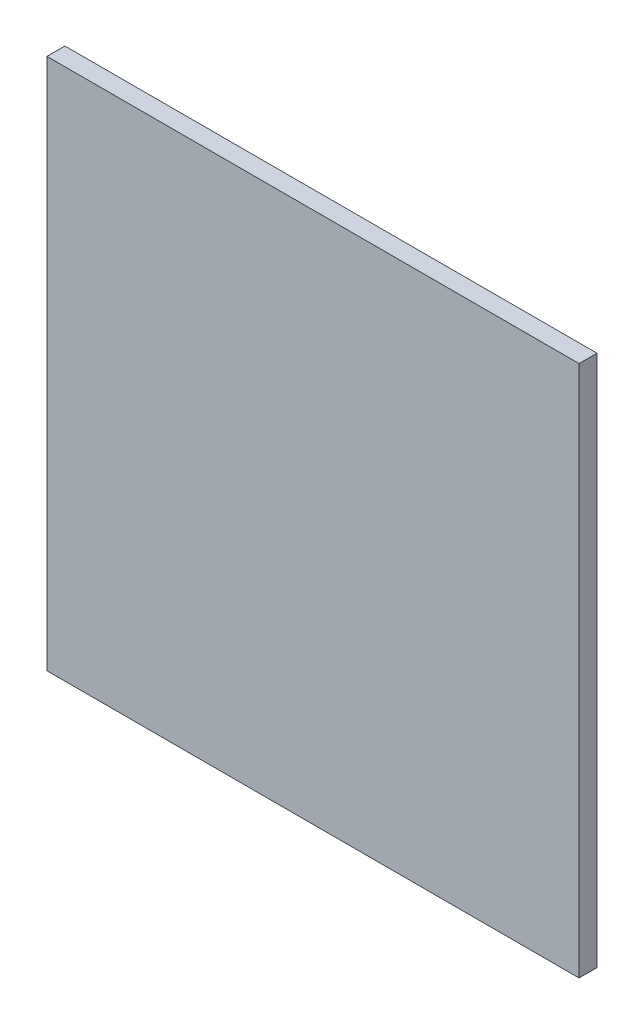
ISO-10303-21;
HEADER;
FILE_DESCRIPTION(('STEP AP214'),'2;1');
FILE_NAME('part.step','',(''),(''),'','','');
FILE_SCHEMA(('AUTOMOTIVE_DESIGN { 1 0 10303 214 1 1 1 1 }'));
ENDSEC;
DATA;
#1=APPLICATION_CONTEXT('core data for automotive mechanical design processes');
#2=APPLICATION_PROTOCOL_DEFINITION('international standard','automotive_design',2000,#1);
#3=PRODUCT_CONTEXT('',#1,'mechanical');
#4=PRODUCT('Part','Part','',(#3));
#5=PRODUCT_RELATED_PRODUCT_CATEGORY('part','',(#4));
#6=PRODUCT_DEFINITION_FORMATION('','',#4);
#7=PRODUCT_DEFINITION_CONTEXT('part definition',#1,'design');
#8=PRODUCT_DEFINITION('design','',#6,#7);
#9=PRODUCT_DEFINITION_SHAPE('','',#8);
#10=(LENGTH_UNIT() NAMED_UNIT(*) SI_UNIT(.MILLI.,.METRE.));
#11=(NAMED_UNIT(*) PLANE_ANGLE_UNIT() SI_UNIT($,.RADIAN.));
#12=(NAMED_UNIT(*) SI_UNIT($,.STERADIAN.) SOLID_ANGLE_UNIT());
#13=UNCERTAINTY_MEASURE_WITH_UNIT(LENGTH_MEASURE(1.E-05),#10,'distance_accuracy_value','');
#14=(GEOMETRIC_REPRESENTATION_CONTEXT(3) GLOBAL_UNCERTAINTY_ASSIGNED_CONTEXT((#13)) GLOBAL_UNIT_ASSIGNED_CONTEXT((#10,
#11,#12)) REPRESENTATION_CONTEXT('',''));
#15=CARTESIAN_POINT('',(0.,0.,0.));
#16=DIRECTION('',(0.,0.,1.));
#17=DIRECTION('',(1.,0.,0.));
#18=AXIS2_PLACEMENT_3D('',#15,#16,#17);
#19=CARTESIAN_POINT('',(0.,82.7,-2.7));
#20=DIRECTION('',(1.,0.,0.));
#21=DIRECTION('',(0.,0.,-1.));
#22=AXIS2_PLACEMENT_3D('',#19,#20,#21);
#23=PLANE('',#22);
#24=DIRECTION('',(0.,1.,0.));
#25=VECTOR('',#24,1.);
#26=CARTESIAN_POINT('',(0.,82.7,0.));
#27=LINE('',#26,#25);
#28=CARTESIAN_POINT('',(0.,2.7,0.));
#29=VERTEX_POINT('',#28);
#30=CARTESIAN_POINT('',(0.,82.7,0.));
#31=VERTEX_POINT('',#30);
#32=EDGE_CURVE('E97',#29,#31,#27,.T.);
#33=ORIENTED_EDGE('',*,*,#32,.F.);
#34=DIRECTION('',(0.,0.,1.));
#35=VECTOR('',#34,1.);
#36=CARTESIAN_POINT('',(0.,2.7,-2.7));
#37=LINE('',#36,#35);
#38=CARTESIAN_POINT('',(0.,2.7,-2.7));
#39=VERTEX_POINT('',#38);
#40=EDGE_CURVE('E11',#39,#29,#37,.T.);
#41=ORIENTED_EDGE('',*,*,#40,.F.);
#42=DIRECTION('',(0.,1.,0.));
#43=VECTOR('',#42,1.);
#44=CARTESIAN_POINT('',(0.,82.7,-2.7));
#45=LINE('',#44,#43);
#46=CARTESIAN_POINT('',(0.,82.7,-2.7));
#47=VERTEX_POINT('',#46);
#48=EDGE_CURVE('E91',#39,#47,#45,.T.);
#49=ORIENTED_EDGE('',*,*,#48,.T.);
#50=DIRECTION('',(0.,0.,1.));
#51=VECTOR('',#50,1.);
#52=CARTESIAN_POINT('',(0.,82.7,-2.7));
#53=LINE('',#52,#51);
#54=EDGE_CURVE('E36',#47,#31,#53,.T.);
#55=ORIENTED_EDGE('',*,*,#54,.T.);
#56=EDGE_LOOP('',(#33,#41,#49,#55));
#57=FACE_BOUND('',#56,.T.);
#58=ADVANCED_FACE('F33',(#57),#23,.T.);
#59=CARTESIAN_POINT('',(0.,2.7,-2.7));
#60=DIRECTION('',(0.,-1.,0.));
#61=DIRECTION('',(0.,0.,-1.));
#62=AXIS2_PLACEMENT_3D('',#59,#60,#61);
#63=PLANE('',#62);
#64=DIRECTION('',(1.,0.,0.));
#65=VECTOR('',#64,1.);
#66=CARTESIAN_POINT('',(0.,2.7,0.));
#67=LINE('',#66,#65);
#68=CARTESIAN_POINT('',(-80.,2.7,0.));
#69=VERTEX_POINT('',#68);
#70=EDGE_CURVE('E93',#69,#29,#67,.T.);
#71=ORIENTED_EDGE('',*,*,#70,.F.);
#72=DIRECTION('',(0.,0.,1.));
#73=VECTOR('',#72,1.);
#74=CARTESIAN_POINT('',(-80.,2.7,-2.7));
#75=LINE('',#74,#73);
#76=CARTESIAN_POINT('',(-80.,2.7,-2.7));
#77=VERTEX_POINT('',#76);
#78=EDGE_CURVE('E42',#77,#69,#75,.T.);
#79=ORIENTED_EDGE('',*,*,#78,.F.);
#80=DIRECTION('',(1.,0.,0.));
#81=VECTOR('',#80,1.);
#82=CARTESIAN_POINT('',(0.,2.7,-2.7));
#83=LINE('',#82,#81);
#84=EDGE_CURVE('E88',#77,#39,#83,.T.);
#85=ORIENTED_EDGE('',*,*,#84,.T.);
#86=ORIENTED_EDGE('',*,*,#40,.T.);
#87=EDGE_LOOP('',(#71,#79,#85,#86));
#88=FACE_BOUND('',#87,.T.);
#89=ADVANCED_FACE('F107',(#88),#63,.T.);
#90=CARTESIAN_POINT('',(-80.,82.7,-2.7));
#91=DIRECTION('',(-1.,0.,0.));
#92=DIRECTION('',(0.,0.,1.));
#93=AXIS2_PLACEMENT_3D('',#90,#91,#92);
#94=PLANE('',#93);
#95=DIRECTION('',(0.,-1.,0.));
#96=VECTOR('',#95,1.);
#97=CARTESIAN_POINT('',(-80.,82.7,0.));
#98=LINE('',#97,#96);
#99=CARTESIAN_POINT('',(-80.,82.7,0.));
#100=VERTEX_POINT('',#99);
#101=EDGE_CURVE('E83',#100,#69,#98,.T.);
#102=ORIENTED_EDGE('',*,*,#101,.F.);
#103=DIRECTION('',(0.,0.,1.));
#104=VECTOR('',#103,1.);
#105=CARTESIAN_POINT('',(-80.,82.7,-2.7));
#106=LINE('',#105,#104);
#107=CARTESIAN_POINT('',(-80.,82.7,-2.7));
#108=VERTEX_POINT('',#107);
#109=EDGE_CURVE('E78',#108,#100,#106,.T.);
#110=ORIENTED_EDGE('',*,*,#109,.F.);
#111=DIRECTION('',(0.,-1.,0.));
#112=VECTOR('',#111,1.);
#113=CARTESIAN_POINT('',(-80.,82.7,-2.7));
#114=LINE('',#113,#112);
#115=EDGE_CURVE('E81',#108,#77,#114,.T.);
#116=ORIENTED_EDGE('',*,*,#115,.T.);
#117=ORIENTED_EDGE('',*,*,#78,.T.);
#118=EDGE_LOOP('',(#102,#110,#116,#117));
#119=FACE_BOUND('',#118,.T.);
#120=ADVANCED_FACE('F80',(#119),#94,.T.);
#121=CARTESIAN_POINT('',(0.,82.7,-2.7));
#122=DIRECTION('',(0.,1.,0.));
#123=DIRECTION('',(0.,0.,1.));
#124=AXIS2_PLACEMENT_3D('',#121,#122,#123);
#125=PLANE('',#124);
#126=DIRECTION('',(-1.,0.,0.));
#127=VECTOR('',#126,1.);
#128=CARTESIAN_POINT('',(0.,82.7,0.));
#129=LINE('',#128,#127);
#130=EDGE_CURVE('E100',#31,#100,#129,.T.);
#131=ORIENTED_EDGE('',*,*,#130,.F.);
#132=ORIENTED_EDGE('',*,*,#54,.F.);
#133=DIRECTION('',(-1.,0.,0.));
#134=VECTOR('',#133,1.);
#135=CARTESIAN_POINT('',(0.,82.7,-2.7));
#136=LINE('',#135,#134);
#137=EDGE_CURVE('E87',#47,#108,#136,.T.);
#138=ORIENTED_EDGE('',*,*,#137,.T.);
#139=ORIENTED_EDGE('',*,*,#109,.T.);
#140=EDGE_LOOP('',(#131,#132,#138,#139));
#141=FACE_BOUND('',#140,.T.);
#142=ADVANCED_FACE('F90',(#141),#125,.T.);
#143=CARTESIAN_POINT('',(0.,0.,-2.7));
#144=DIRECTION('',(0.,0.,-1.));
#145=DIRECTION('',(-1.,0.,0.));
#146=AXIS2_PLACEMENT_3D('',#143,#144,#145);
#147=PLANE('',#146);
#148=ORIENTED_EDGE('',*,*,#48,.F.);
#149=ORIENTED_EDGE('',*,*,#84,.F.);
#150=ORIENTED_EDGE('',*,*,#115,.F.);
#151=ORIENTED_EDGE('',*,*,#137,.F.);
#152=EDGE_LOOP('',(#148,#149,#150,#151));
#153=FACE_BOUND('',#152,.T.);
#154=ADVANCED_FACE('F86',(#153),#147,.T.);
#155=CARTESIAN_POINT('',(0.,0.,0.));
#156=DIRECTION('',(0.,0.,-1.));
#157=DIRECTION('',(-1.,0.,0.));
#158=AXIS2_PLACEMENT_3D('',#155,#156,#157);
#159=PLANE('',#158);
#160=ORIENTED_EDGE('',*,*,#32,.T.);
#161=ORIENTED_EDGE('',*,*,#130,.T.);
#162=ORIENTED_EDGE('',*,*,#101,.T.);
#163=ORIENTED_EDGE('',*,*,#70,.T.);
#164=EDGE_LOOP('',(#160,#161,#162,#163));
#165=FACE_BOUND('',#164,.T.);
#166=ADVANCED_FACE('F106',(#165),#159,.F.);
#167=CLOSED_SHELL('',(#58,#89,#120,#142,#154,#166));
#168=MANIFOLD_SOLID_BREP('B2',#167);
#169=ADVANCED_BREP_SHAPE_REPRESENTATION('',(#18,#168),#14);
#170=SHAPE_DEFINITION_REPRESENTATION(#9,#169);
ENDSEC;
END-ISO-10303-21;
